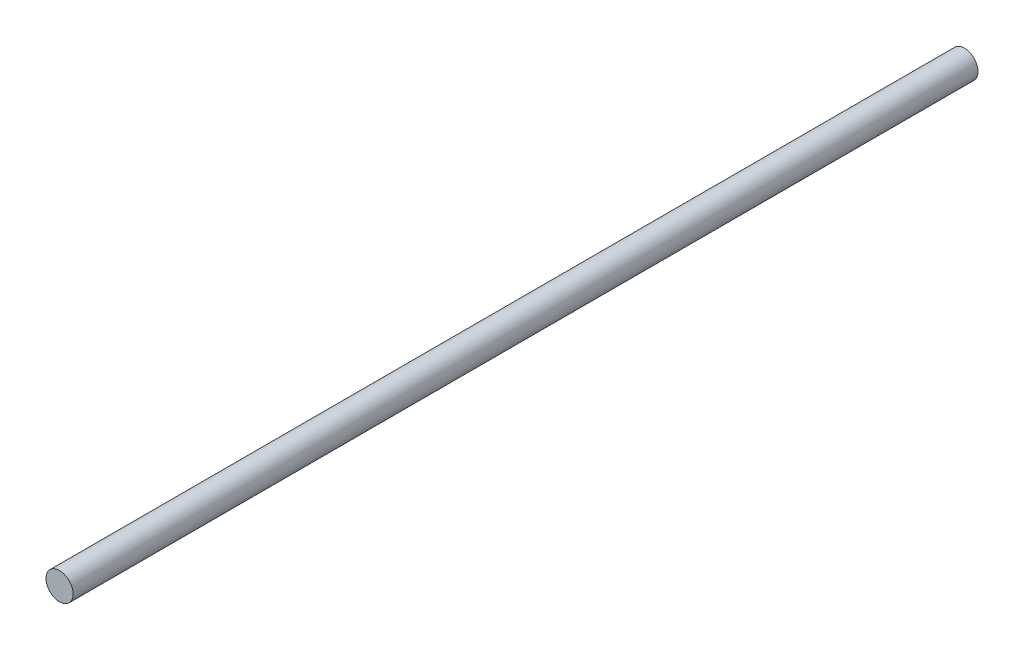
ISO-10303-21;
HEADER;
FILE_DESCRIPTION(('STEP AP214'),'2;1');
FILE_NAME('part.step','',(''),(''),'','','');
FILE_SCHEMA(('AUTOMOTIVE_DESIGN { 1 0 10303 214 1 1 1 1 }'));
ENDSEC;
DATA;
#1=APPLICATION_CONTEXT('core data for automotive mechanical design processes');
#2=APPLICATION_PROTOCOL_DEFINITION('international standard','automotive_design',2000,#1);
#3=PRODUCT_CONTEXT('',#1,'mechanical');
#4=PRODUCT('Part','Part','',(#3));
#5=PRODUCT_RELATED_PRODUCT_CATEGORY('part','',(#4));
#6=PRODUCT_DEFINITION_FORMATION('','',#4);
#7=PRODUCT_DEFINITION_CONTEXT('part definition',#1,'design');
#8=PRODUCT_DEFINITION('design','',#6,#7);
#9=PRODUCT_DEFINITION_SHAPE('','',#8);
#10=(LENGTH_UNIT() NAMED_UNIT(*) SI_UNIT(.MILLI.,.METRE.));
#11=(NAMED_UNIT(*) PLANE_ANGLE_UNIT() SI_UNIT($,.RADIAN.));
#12=(NAMED_UNIT(*) SI_UNIT($,.STERADIAN.) SOLID_ANGLE_UNIT());
#13=UNCERTAINTY_MEASURE_WITH_UNIT(LENGTH_MEASURE(1.E-05),#10,'distance_accuracy_value','');
#14=(GEOMETRIC_REPRESENTATION_CONTEXT(3) GLOBAL_UNCERTAINTY_ASSIGNED_CONTEXT((#13)) GLOBAL_UNIT_ASSIGNED_CONTEXT((#10,
#11,#12)) REPRESENTATION_CONTEXT('',''));
#15=CARTESIAN_POINT('',(0.,0.,0.));
#16=DIRECTION('',(0.,0.,1.));
#17=DIRECTION('',(1.,0.,0.));
#18=AXIS2_PLACEMENT_3D('',#15,#16,#17);
#19=CARTESIAN_POINT('',(-174.485961104551,88.9966607343808,250.));
#20=DIRECTION('',(0.,0.,-1.));
#21=DIRECTION('',(-1.,0.,0.));
#22=AXIS2_PLACEMENT_3D('',#19,#20,#21);
#23=CYLINDRICAL_SURFACE('',#22,3.75000000000001);
#24=CARTESIAN_POINT('',(-174.485961104551,88.9966607343808,250.));
#25=DIRECTION('',(0.,0.,1.));
#26=DIRECTION('',(1.,0.,0.));
#27=AXIS2_PLACEMENT_3D('',#24,#25,#26);
#28=CIRCLE('',#27,3.75000000000001);
#29=CARTESIAN_POINT('',(-170.735961104551,88.9966607343808,250.));
#30=VERTEX_POINT('',#29);
#31=EDGE_CURVE('E10',#30,#30,#28,.T.);
#32=ORIENTED_EDGE('',*,*,#31,.F.);
#33=EDGE_LOOP('',(#32));
#34=FACE_BOUND('',#33,.T.);
#35=CARTESIAN_POINT('',(-174.485961104551,88.9966607343808,0.));
#36=DIRECTION('',(0.,0.,1.));
#37=DIRECTION('',(1.,0.,0.));
#38=AXIS2_PLACEMENT_3D('',#35,#36,#37);
#39=CIRCLE('',#38,3.75000000000001);
#40=CARTESIAN_POINT('',(-170.735961104551,88.9966607343808,0.));
#41=VERTEX_POINT('',#40);
#42=EDGE_CURVE('E34',#41,#41,#39,.T.);
#43=ORIENTED_EDGE('',*,*,#42,.T.);
#44=EDGE_LOOP('',(#43));
#45=FACE_BOUND('',#44,.T.);
#46=ADVANCED_FACE('F31',(#34,#45),#23,.T.);
#47=CARTESIAN_POINT('',(-174.485961104551,88.9966607343808,250.));
#48=DIRECTION('',(0.,0.,1.));
#49=DIRECTION('',(1.,0.,0.));
#50=AXIS2_PLACEMENT_3D('',#47,#48,#49);
#51=PLANE('',#50);
#52=ORIENTED_EDGE('',*,*,#31,.T.);
#53=EDGE_LOOP('',(#52));
#54=FACE_BOUND('',#53,.T.);
#55=ADVANCED_FACE('F46',(#54),#51,.T.);
#56=CARTESIAN_POINT('',(-174.485961104551,88.9966607343808,0.));
#57=DIRECTION('',(0.,0.,1.));
#58=DIRECTION('',(1.,0.,0.));
#59=AXIS2_PLACEMENT_3D('',#56,#57,#58);
#60=PLANE('',#59);
#61=ORIENTED_EDGE('',*,*,#42,.F.);
#62=EDGE_LOOP('',(#61));
#63=FACE_BOUND('',#62,.T.);
#64=ADVANCED_FACE('F44',(#63),#60,.F.);
#65=CLOSED_SHELL('',(#46,#55,#64));
#66=MANIFOLD_SOLID_BREP('B2',#65);
#67=ADVANCED_BREP_SHAPE_REPRESENTATION('',(#18,#66),#14);
#68=SHAPE_DEFINITION_REPRESENTATION(#9,#67);
ENDSEC;
END-ISO-10303-21;
